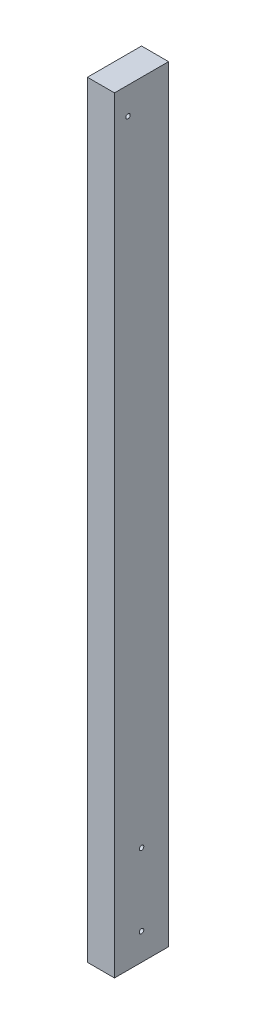
ISO-10303-21;
HEADER;
FILE_DESCRIPTION(('STEP AP214'),'2;1');
FILE_NAME('part.step','',(''),(''),'','','');
FILE_SCHEMA(('AUTOMOTIVE_DESIGN { 1 0 10303 214 1 1 1 1 }'));
ENDSEC;
DATA;
#1=APPLICATION_CONTEXT('core data for automotive mechanical design processes');
#2=APPLICATION_PROTOCOL_DEFINITION('international standard','automotive_design',2000,#1);
#3=PRODUCT_CONTEXT('',#1,'mechanical');
#4=PRODUCT('Part','Part','',(#3));
#5=PRODUCT_RELATED_PRODUCT_CATEGORY('part','',(#4));
#6=PRODUCT_DEFINITION_FORMATION('','',#4);
#7=PRODUCT_DEFINITION_CONTEXT('part definition',#1,'design');
#8=PRODUCT_DEFINITION('design','',#6,#7);
#9=PRODUCT_DEFINITION_SHAPE('','',#8);
#10=(LENGTH_UNIT() NAMED_UNIT(*) SI_UNIT(.MILLI.,.METRE.));
#11=(NAMED_UNIT(*) PLANE_ANGLE_UNIT() SI_UNIT($,.RADIAN.));
#12=(NAMED_UNIT(*) SI_UNIT($,.STERADIAN.) SOLID_ANGLE_UNIT());
#13=UNCERTAINTY_MEASURE_WITH_UNIT(LENGTH_MEASURE(1.E-05),#10,'distance_accuracy_value','');
#14=(GEOMETRIC_REPRESENTATION_CONTEXT(3) GLOBAL_UNCERTAINTY_ASSIGNED_CONTEXT((#13)) GLOBAL_UNIT_ASSIGNED_CONTEXT((#10,
#11,#12)) REPRESENTATION_CONTEXT('',''));
#15=CARTESIAN_POINT('',(0.,0.,0.));
#16=DIRECTION('',(0.,0.,1.));
#17=DIRECTION('',(1.,0.,0.));
#18=AXIS2_PLACEMENT_3D('',#15,#16,#17);
#19=CARTESIAN_POINT('',(587.375,0.,0.));
#20=DIRECTION('',(1.,0.,0.));
#21=DIRECTION('',(0.,0.,-1.));
#22=AXIS2_PLACEMENT_3D('',#19,#20,#21);
#23=PLANE('',#22);
#24=CARTESIAN_POINT('',(587.375,-482.6,1047.75));
#25=DIRECTION('',(-1.,0.,0.));
#26=DIRECTION('',(0.,0.,1.));
#27=AXIS2_PLACEMENT_3D('',#24,#25,#26);
#28=CIRCLE('',#27,1.5875);
#29=CARTESIAN_POINT('',(587.375,-482.6,1049.3375));
#30=VERTEX_POINT('',#29);
#31=EDGE_CURVE('E88',#30,#30,#28,.T.);
#32=ORIENTED_EDGE('',*,*,#31,.T.);
#33=EDGE_LOOP('',(#32));
#34=FACE_BOUND('',#33,.T.);
#35=CARTESIAN_POINT('',(587.375,-431.8,1047.75));
#36=DIRECTION('',(-1.,0.,0.));
#37=DIRECTION('',(0.,0.,1.));
#38=AXIS2_PLACEMENT_3D('',#35,#36,#37);
#39=CIRCLE('',#38,1.5875);
#40=CARTESIAN_POINT('',(587.375,-431.8,1049.3375));
#41=VERTEX_POINT('',#40);
#42=EDGE_CURVE('E90',#41,#41,#39,.T.);
#43=ORIENTED_EDGE('',*,*,#42,.T.);
#44=EDGE_LOOP('',(#43));
#45=FACE_BOUND('',#44,.T.);
#46=CARTESIAN_POINT('',(587.375,19.05,1057.275));
#47=DIRECTION('',(-1.,0.,0.));
#48=DIRECTION('',(0.,0.,1.));
#49=AXIS2_PLACEMENT_3D('',#46,#47,#48);
#50=CIRCLE('',#49,1.5875);
#51=CARTESIAN_POINT('',(587.375,19.05,1058.8625));
#52=VERTEX_POINT('',#51);
#53=EDGE_CURVE('E19',#52,#52,#50,.T.);
#54=ORIENTED_EDGE('',*,*,#53,.T.);
#55=EDGE_LOOP('',(#54));
#56=FACE_BOUND('',#55,.T.);
#57=DIRECTION('',(0.,0.,1.));
#58=VECTOR('',#57,1.);
#59=CARTESIAN_POINT('',(587.375,38.1,1028.7));
#60=LINE('',#59,#58);
#61=CARTESIAN_POINT('',(587.375,38.1,1066.8));
#62=VERTEX_POINT('',#61);
#63=CARTESIAN_POINT('',(587.375,38.1,1028.7));
#64=VERTEX_POINT('',#63);
#65=EDGE_CURVE('E70',#62,#64,#60,.F.);
#66=ORIENTED_EDGE('',*,*,#65,.F.);
#67=DIRECTION('',(0.,1.,0.));
#68=VECTOR('',#67,1.);
#69=CARTESIAN_POINT('',(587.375,38.1,1066.8));
#70=LINE('',#69,#68);
#71=CARTESIAN_POINT('',(587.375,-501.65,1066.8));
#72=VERTEX_POINT('',#71);
#73=EDGE_CURVE('E67',#72,#62,#70,.T.);
#74=ORIENTED_EDGE('',*,*,#73,.F.);
#75=DIRECTION('',(0.,0.,-1.));
#76=VECTOR('',#75,1.);
#77=CARTESIAN_POINT('',(587.375,-501.65,1066.8));
#78=LINE('',#77,#76);
#79=CARTESIAN_POINT('',(587.375,-501.65,1028.7));
#80=VERTEX_POINT('',#79);
#81=EDGE_CURVE('E58',#80,#72,#78,.F.);
#82=ORIENTED_EDGE('',*,*,#81,.F.);
#83=DIRECTION('',(0.,1.,0.));
#84=VECTOR('',#83,1.);
#85=CARTESIAN_POINT('',(587.375,-501.65,1028.7));
#86=LINE('',#85,#84);
#87=EDGE_CURVE('E53',#64,#80,#86,.F.);
#88=ORIENTED_EDGE('',*,*,#87,.F.);
#89=EDGE_LOOP('',(#66,#74,#82,#88));
#90=FACE_BOUND('',#89,.T.);
#91=ADVANCED_FACE('F16',(#34,#45,#56,#90),#23,.T.);
#92=CARTESIAN_POINT('',(568.325,38.1,1066.8));
#93=DIRECTION('',(0.,0.,1.));
#94=DIRECTION('',(1.,0.,0.));
#95=AXIS2_PLACEMENT_3D('',#92,#93,#94);
#96=PLANE('',#95);
#97=DIRECTION('',(1.,0.,0.));
#98=VECTOR('',#97,1.);
#99=CARTESIAN_POINT('',(568.325,38.1,1066.8));
#100=LINE('',#99,#98);
#101=CARTESIAN_POINT('',(568.325,38.1,1066.8));
#102=VERTEX_POINT('',#101);
#103=EDGE_CURVE('E98',#102,#62,#100,.T.);
#104=ORIENTED_EDGE('',*,*,#103,.F.);
#105=DIRECTION('',(0.,1.,0.));
#106=VECTOR('',#105,1.);
#107=CARTESIAN_POINT('',(568.325,0.,1066.8));
#108=LINE('',#107,#106);
#109=CARTESIAN_POINT('',(568.325,-501.65,1066.8));
#110=VERTEX_POINT('',#109);
#111=EDGE_CURVE('E77',#102,#110,#108,.F.);
#112=ORIENTED_EDGE('',*,*,#111,.T.);
#113=DIRECTION('',(1.,0.,0.));
#114=VECTOR('',#113,1.);
#115=CARTESIAN_POINT('',(568.325,-501.65,1066.8));
#116=LINE('',#115,#114);
#117=EDGE_CURVE('E63',#72,#110,#116,.F.);
#118=ORIENTED_EDGE('',*,*,#117,.F.);
#119=ORIENTED_EDGE('',*,*,#73,.T.);
#120=EDGE_LOOP('',(#104,#112,#118,#119));
#121=FACE_BOUND('',#120,.T.);
#122=ADVANCED_FACE('F76',(#121),#96,.T.);
#123=CARTESIAN_POINT('',(568.325,-501.65,1066.8));
#124=DIRECTION('',(0.,-1.,0.));
#125=DIRECTION('',(0.,0.,-1.));
#126=AXIS2_PLACEMENT_3D('',#123,#124,#125);
#127=PLANE('',#126);
#128=ORIENTED_EDGE('',*,*,#117,.T.);
#129=DIRECTION('',(0.,0.,-1.));
#130=VECTOR('',#129,1.);
#131=CARTESIAN_POINT('',(568.325,-501.65,0.));
#132=LINE('',#131,#130);
#133=CARTESIAN_POINT('',(568.325,-501.65,1028.7));
#134=VERTEX_POINT('',#133);
#135=EDGE_CURVE('E109',#110,#134,#132,.T.);
#136=ORIENTED_EDGE('',*,*,#135,.T.);
#137=DIRECTION('',(-1.,0.,0.));
#138=VECTOR('',#137,1.);
#139=CARTESIAN_POINT('',(568.325,-501.65,1028.7));
#140=LINE('',#139,#138);
#141=EDGE_CURVE('E65',#80,#134,#140,.T.);
#142=ORIENTED_EDGE('',*,*,#141,.F.);
#143=ORIENTED_EDGE('',*,*,#81,.T.);
#144=EDGE_LOOP('',(#128,#136,#142,#143));
#145=FACE_BOUND('',#144,.T.);
#146=ADVANCED_FACE('F60',(#145),#127,.T.);
#147=CARTESIAN_POINT('',(568.325,-501.65,1028.7));
#148=DIRECTION('',(0.,0.,-1.));
#149=DIRECTION('',(-1.,0.,0.));
#150=AXIS2_PLACEMENT_3D('',#147,#148,#149);
#151=PLANE('',#150);
#152=ORIENTED_EDGE('',*,*,#141,.T.);
#153=DIRECTION('',(0.,1.,0.));
#154=VECTOR('',#153,1.);
#155=CARTESIAN_POINT('',(568.325,0.,1028.7));
#156=LINE('',#155,#154);
#157=CARTESIAN_POINT('',(568.325,38.1,1028.7));
#158=VERTEX_POINT('',#157);
#159=EDGE_CURVE('E106',#134,#158,#156,.T.);
#160=ORIENTED_EDGE('',*,*,#159,.T.);
#161=DIRECTION('',(1.,0.,0.));
#162=VECTOR('',#161,1.);
#163=CARTESIAN_POINT('',(568.325,38.1,1028.7));
#164=LINE('',#163,#162);
#165=EDGE_CURVE('E34',#64,#158,#164,.F.);
#166=ORIENTED_EDGE('',*,*,#165,.F.);
#167=ORIENTED_EDGE('',*,*,#87,.T.);
#168=EDGE_LOOP('',(#152,#160,#166,#167));
#169=FACE_BOUND('',#168,.T.);
#170=ADVANCED_FACE('F105',(#169),#151,.T.);
#171=CARTESIAN_POINT('',(568.325,38.1,1028.7));
#172=DIRECTION('',(0.,1.,0.));
#173=DIRECTION('',(0.,0.,1.));
#174=AXIS2_PLACEMENT_3D('',#171,#172,#173);
#175=PLANE('',#174);
#176=ORIENTED_EDGE('',*,*,#165,.T.);
#177=DIRECTION('',(0.,0.,-1.));
#178=VECTOR('',#177,1.);
#179=CARTESIAN_POINT('',(568.325,38.1,0.));
#180=LINE('',#179,#178);
#181=EDGE_CURVE('E87',#158,#102,#180,.F.);
#182=ORIENTED_EDGE('',*,*,#181,.T.);
#183=ORIENTED_EDGE('',*,*,#103,.T.);
#184=ORIENTED_EDGE('',*,*,#65,.T.);
#185=EDGE_LOOP('',(#176,#182,#183,#184));
#186=FACE_BOUND('',#185,.T.);
#187=ADVANCED_FACE('F112',(#186),#175,.T.);
#188=CARTESIAN_POINT('',(-587.375,19.05,1057.275));
#189=DIRECTION('',(-1.,0.,0.));
#190=DIRECTION('',(0.,0.,1.));
#191=AXIS2_PLACEMENT_3D('',#188,#189,#190);
#192=CYLINDRICAL_SURFACE('',#191,1.5875);
#193=ORIENTED_EDGE('',*,*,#53,.F.);
#194=EDGE_LOOP('',(#193));
#195=FACE_BOUND('',#194,.T.);
#196=CARTESIAN_POINT('',(568.325,19.05,1057.275));
#197=DIRECTION('',(-1.,0.,0.));
#198=DIRECTION('',(0.,0.,1.));
#199=AXIS2_PLACEMENT_3D('',#196,#197,#198);
#200=CIRCLE('',#199,1.5875);
#201=CARTESIAN_POINT('',(568.325,19.05,1058.8625));
#202=VERTEX_POINT('',#201);
#203=EDGE_CURVE('E84',#202,#202,#200,.T.);
#204=ORIENTED_EDGE('',*,*,#203,.T.);
#205=EDGE_LOOP('',(#204));
#206=FACE_BOUND('',#205,.T.);
#207=ADVANCED_FACE('F114',(#195,#206),#192,.F.);
#208=CARTESIAN_POINT('',(-587.375,-431.8,1047.75));
#209=DIRECTION('',(-1.,0.,0.));
#210=DIRECTION('',(0.,0.,1.));
#211=AXIS2_PLACEMENT_3D('',#208,#209,#210);
#212=CYLINDRICAL_SURFACE('',#211,1.5875);
#213=ORIENTED_EDGE('',*,*,#42,.F.);
#214=EDGE_LOOP('',(#213));
#215=FACE_BOUND('',#214,.T.);
#216=CARTESIAN_POINT('',(568.325,-431.8,1047.75));
#217=DIRECTION('',(-1.,0.,0.));
#218=DIRECTION('',(0.,0.,1.));
#219=AXIS2_PLACEMENT_3D('',#216,#217,#218);
#220=CIRCLE('',#219,1.5875);
#221=CARTESIAN_POINT('',(568.325,-431.8,1049.3375));
#222=VERTEX_POINT('',#221);
#223=EDGE_CURVE('E25',#222,#222,#220,.T.);
#224=ORIENTED_EDGE('',*,*,#223,.T.);
#225=EDGE_LOOP('',(#224));
#226=FACE_BOUND('',#225,.T.);
#227=ADVANCED_FACE('F121',(#215,#226),#212,.F.);
#228=CARTESIAN_POINT('',(-587.375,-482.6,1047.75));
#229=DIRECTION('',(-1.,0.,0.));
#230=DIRECTION('',(0.,0.,1.));
#231=AXIS2_PLACEMENT_3D('',#228,#229,#230);
#232=CYLINDRICAL_SURFACE('',#231,1.5875);
#233=ORIENTED_EDGE('',*,*,#31,.F.);
#234=EDGE_LOOP('',(#233));
#235=FACE_BOUND('',#234,.T.);
#236=CARTESIAN_POINT('',(568.325,-482.6,1047.75));
#237=DIRECTION('',(-1.,0.,0.));
#238=DIRECTION('',(0.,0.,1.));
#239=AXIS2_PLACEMENT_3D('',#236,#237,#238);
#240=CIRCLE('',#239,1.5875);
#241=CARTESIAN_POINT('',(568.325,-482.6,1049.3375));
#242=VERTEX_POINT('',#241);
#243=EDGE_CURVE('E11',#242,#242,#240,.T.);
#244=ORIENTED_EDGE('',*,*,#243,.T.);
#245=EDGE_LOOP('',(#244));
#246=FACE_BOUND('',#245,.T.);
#247=ADVANCED_FACE('F126',(#235,#246),#232,.F.);
#248=CARTESIAN_POINT('',(568.325,0.,0.));
#249=DIRECTION('',(1.,0.,0.));
#250=DIRECTION('',(0.,0.,-1.));
#251=AXIS2_PLACEMENT_3D('',#248,#249,#250);
#252=PLANE('',#251);
#253=ORIENTED_EDGE('',*,*,#243,.F.);
#254=EDGE_LOOP('',(#253));
#255=FACE_BOUND('',#254,.T.);
#256=ORIENTED_EDGE('',*,*,#223,.F.);
#257=EDGE_LOOP('',(#256));
#258=FACE_BOUND('',#257,.T.);
#259=ORIENTED_EDGE('',*,*,#203,.F.);
#260=EDGE_LOOP('',(#259));
#261=FACE_BOUND('',#260,.T.);
#262=ORIENTED_EDGE('',*,*,#159,.F.);
#263=ORIENTED_EDGE('',*,*,#135,.F.);
#264=ORIENTED_EDGE('',*,*,#111,.F.);
#265=ORIENTED_EDGE('',*,*,#181,.F.);
#266=EDGE_LOOP('',(#262,#263,#264,#265));
#267=FACE_BOUND('',#266,.T.);
#268=ADVANCED_FACE('F108',(#255,#258,#261,#267),#252,.F.);
#269=CLOSED_SHELL('',(#91,#122,#146,#170,#187,#207,#227,#247,#268));
#270=MANIFOLD_SOLID_BREP('B1',#269);
#271=ADVANCED_BREP_SHAPE_REPRESENTATION('',(#18,#270),#14);
#272=SHAPE_DEFINITION_REPRESENTATION(#9,#271);
ENDSEC;
END-ISO-10303-21;
